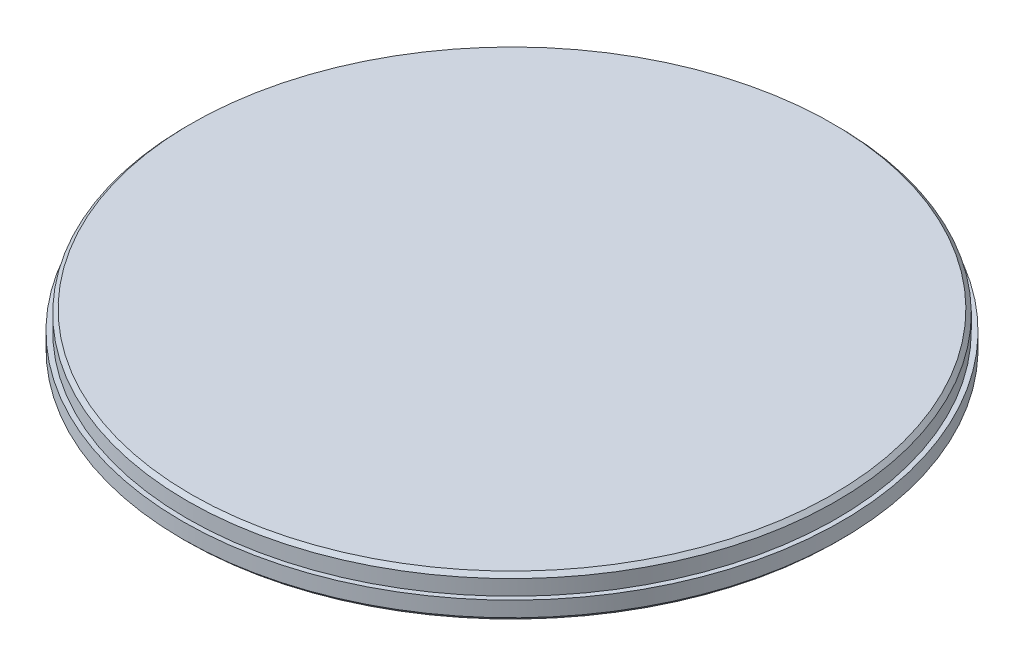
ISO-10303-21;
HEADER;
FILE_DESCRIPTION(('STEP AP214'),'2;1');
FILE_NAME('part.step','',(''),(''),'','','');
FILE_SCHEMA(('AUTOMOTIVE_DESIGN { 1 0 10303 214 1 1 1 1 }'));
ENDSEC;
DATA;
#1=APPLICATION_CONTEXT('core data for automotive mechanical design processes');
#2=APPLICATION_PROTOCOL_DEFINITION('international standard','automotive_design',2000,#1);
#3=PRODUCT_CONTEXT('',#1,'mechanical');
#4=PRODUCT('Part','Part','',(#3));
#5=PRODUCT_RELATED_PRODUCT_CATEGORY('part','',(#4));
#6=PRODUCT_DEFINITION_FORMATION('','',#4);
#7=PRODUCT_DEFINITION_CONTEXT('part definition',#1,'design');
#8=PRODUCT_DEFINITION('design','',#6,#7);
#9=PRODUCT_DEFINITION_SHAPE('','',#8);
#10=(LENGTH_UNIT() NAMED_UNIT(*) SI_UNIT(.MILLI.,.METRE.));
#11=(NAMED_UNIT(*) PLANE_ANGLE_UNIT() SI_UNIT($,.RADIAN.));
#12=(NAMED_UNIT(*) SI_UNIT($,.STERADIAN.) SOLID_ANGLE_UNIT());
#13=UNCERTAINTY_MEASURE_WITH_UNIT(LENGTH_MEASURE(1.E-05),#10,'distance_accuracy_value','');
#14=(GEOMETRIC_REPRESENTATION_CONTEXT(3) GLOBAL_UNCERTAINTY_ASSIGNED_CONTEXT((#13)) GLOBAL_UNIT_ASSIGNED_CONTEXT((#10,
#11,#12)) REPRESENTATION_CONTEXT('',''));
#15=CARTESIAN_POINT('',(0.,0.,0.));
#16=DIRECTION('',(0.,0.,1.));
#17=DIRECTION('',(1.,0.,0.));
#18=AXIS2_PLACEMENT_3D('',#15,#16,#17);
#19=CARTESIAN_POINT('',(0.,2.,0.));
#20=DIRECTION('',(0.,-1.,0.));
#21=DIRECTION('',(0.,0.,-1.));
#22=AXIS2_PLACEMENT_3D('',#19,#20,#21);
#23=CYLINDRICAL_SURFACE('',#22,17.25);
#24=CARTESIAN_POINT('',(0.,0.200000000000006,0.));
#25=DIRECTION('',(0.,1.,0.));
#26=DIRECTION('',(0.,0.,1.));
#27=AXIS2_PLACEMENT_3D('',#24,#25,#26);
#28=CIRCLE('',#27,17.25);
#29=CARTESIAN_POINT('',(0.,0.200000000000006,17.25));
#30=VERTEX_POINT('',#29);
#31=EDGE_CURVE('E61',#30,#30,#28,.T.);
#32=ORIENTED_EDGE('',*,*,#31,.T.);
#33=EDGE_LOOP('',(#32));
#34=FACE_BOUND('',#33,.T.);
#35=CARTESIAN_POINT('',(0.,1.,0.));
#36=DIRECTION('',(0.,1.,0.));
#37=DIRECTION('',(0.,0.,1.));
#38=AXIS2_PLACEMENT_3D('',#35,#36,#37);
#39=CIRCLE('',#38,17.25);
#40=CARTESIAN_POINT('',(0.,1.,17.25));
#41=VERTEX_POINT('',#40);
#42=EDGE_CURVE('E67',#41,#41,#39,.T.);
#43=ORIENTED_EDGE('',*,*,#42,.F.);
#44=EDGE_LOOP('',(#43));
#45=FACE_BOUND('',#44,.T.);
#46=ADVANCED_FACE('F42',(#34,#45),#23,.T.);
#47=CARTESIAN_POINT('',(0.,0.,0.));
#48=DIRECTION('',(0.,1.,0.));
#49=DIRECTION('',(0.,0.,1.));
#50=AXIS2_PLACEMENT_3D('',#47,#48,#49);
#51=PLANE('',#50);
#52=CARTESIAN_POINT('',(0.,0.,0.));
#53=DIRECTION('',(0.,1.,0.));
#54=DIRECTION('',(0.,0.,1.));
#55=AXIS2_PLACEMENT_3D('',#52,#53,#54);
#56=CIRCLE('',#55,17.05);
#57=CARTESIAN_POINT('',(0.,0.,17.05));
#58=VERTEX_POINT('',#57);
#59=EDGE_CURVE('E56',#58,#58,#56,.F.);
#60=ORIENTED_EDGE('',*,*,#59,.T.);
#61=EDGE_LOOP('',(#60));
#62=FACE_BOUND('',#61,.T.);
#63=ADVANCED_FACE('F81',(#62),#51,.F.);
#64=CARTESIAN_POINT('',(0.,1.,0.));
#65=DIRECTION('',(0.,1.,0.));
#66=DIRECTION('',(0.,0.,1.));
#67=AXIS2_PLACEMENT_3D('',#64,#65,#66);
#68=PLANE('',#67);
#69=CARTESIAN_POINT('',(0.,1.,0.));
#70=DIRECTION('',(0.,1.,0.));
#71=DIRECTION('',(0.,0.,1.));
#72=AXIS2_PLACEMENT_3D('',#69,#70,#71);
#73=CIRCLE('',#72,17.);
#74=CARTESIAN_POINT('',(0.,1.,17.));
#75=VERTEX_POINT('',#74);
#76=EDGE_CURVE('E71',#75,#75,#73,.T.);
#77=ORIENTED_EDGE('',*,*,#76,.F.);
#78=EDGE_LOOP('',(#77));
#79=FACE_BOUND('',#78,.T.);
#80=ORIENTED_EDGE('',*,*,#42,.T.);
#81=EDGE_LOOP('',(#80));
#82=FACE_BOUND('',#81,.T.);
#83=ADVANCED_FACE('F78',(#79,#82),#68,.T.);
#84=CARTESIAN_POINT('',(0.,1.,0.));
#85=DIRECTION('',(0.,1.,0.));
#86=DIRECTION('',(0.,0.,1.));
#87=AXIS2_PLACEMENT_3D('',#84,#85,#86);
#88=CYLINDRICAL_SURFACE('',#87,17.);
#89=CARTESIAN_POINT('',(0.,1.8,0.));
#90=DIRECTION('',(0.,1.,0.));
#91=DIRECTION('',(0.,0.,1.));
#92=AXIS2_PLACEMENT_3D('',#89,#90,#91);
#93=CIRCLE('',#92,17.);
#94=CARTESIAN_POINT('',(0.,1.8,17.));
#95=VERTEX_POINT('',#94);
#96=EDGE_CURVE('E11',#95,#95,#93,.F.);
#97=ORIENTED_EDGE('',*,*,#96,.T.);
#98=EDGE_LOOP('',(#97));
#99=FACE_BOUND('',#98,.T.);
#100=ORIENTED_EDGE('',*,*,#76,.T.);
#101=EDGE_LOOP('',(#100));
#102=FACE_BOUND('',#101,.T.);
#103=ADVANCED_FACE('F76',(#99,#102),#88,.T.);
#104=CARTESIAN_POINT('',(0.,2.,0.));
#105=DIRECTION('',(0.,1.,0.));
#106=DIRECTION('',(0.,0.,1.));
#107=AXIS2_PLACEMENT_3D('',#104,#105,#106);
#108=PLANE('',#107);
#109=CARTESIAN_POINT('',(0.,2.,0.));
#110=DIRECTION('',(0.,1.,0.));
#111=DIRECTION('',(0.,0.,1.));
#112=AXIS2_PLACEMENT_3D('',#109,#110,#111);
#113=CIRCLE('',#112,16.8);
#114=CARTESIAN_POINT('',(0.,2.,16.8));
#115=VERTEX_POINT('',#114);
#116=EDGE_CURVE('E51',#115,#115,#113,.T.);
#117=ORIENTED_EDGE('',*,*,#116,.T.);
#118=EDGE_LOOP('',(#117));
#119=FACE_BOUND('',#118,.T.);
#120=ADVANCED_FACE('F99',(#119),#108,.T.);
#121=CARTESIAN_POINT('',(0.,0.200000000000006,0.));
#122=DIRECTION('',(0.,1.,0.));
#123=DIRECTION('',(0.,0.,1.));
#124=AXIS2_PLACEMENT_3D('',#121,#122,#123);
#125=CONICAL_SURFACE('',#124,17.25,0.785398163397457);
#126=ORIENTED_EDGE('',*,*,#59,.F.);
#127=EDGE_LOOP('',(#126));
#128=FACE_BOUND('',#127,.T.);
#129=ORIENTED_EDGE('',*,*,#31,.F.);
#130=EDGE_LOOP('',(#129));
#131=FACE_BOUND('',#130,.T.);
#132=ADVANCED_FACE('F95',(#128,#131),#125,.T.);
#133=CARTESIAN_POINT('',(0.,2.,0.));
#134=DIRECTION('',(0.,-1.,0.));
#135=DIRECTION('',(0.,0.,-1.));
#136=AXIS2_PLACEMENT_3D('',#133,#134,#135);
#137=CONICAL_SURFACE('',#136,16.8,0.785398163397457);
#138=ORIENTED_EDGE('',*,*,#96,.F.);
#139=EDGE_LOOP('',(#138));
#140=FACE_BOUND('',#139,.T.);
#141=ORIENTED_EDGE('',*,*,#116,.F.);
#142=EDGE_LOOP('',(#141));
#143=FACE_BOUND('',#142,.T.);
#144=ADVANCED_FACE('F45',(#140,#143),#137,.T.);
#145=CLOSED_SHELL('',(#46,#63,#83,#103,#120,#132,#144));
#146=MANIFOLD_SOLID_BREP('B2',#145);
#147=ADVANCED_BREP_SHAPE_REPRESENTATION('',(#18,#146),#14);
#148=SHAPE_DEFINITION_REPRESENTATION(#9,#147);
ENDSEC;
END-ISO-10303-21;
